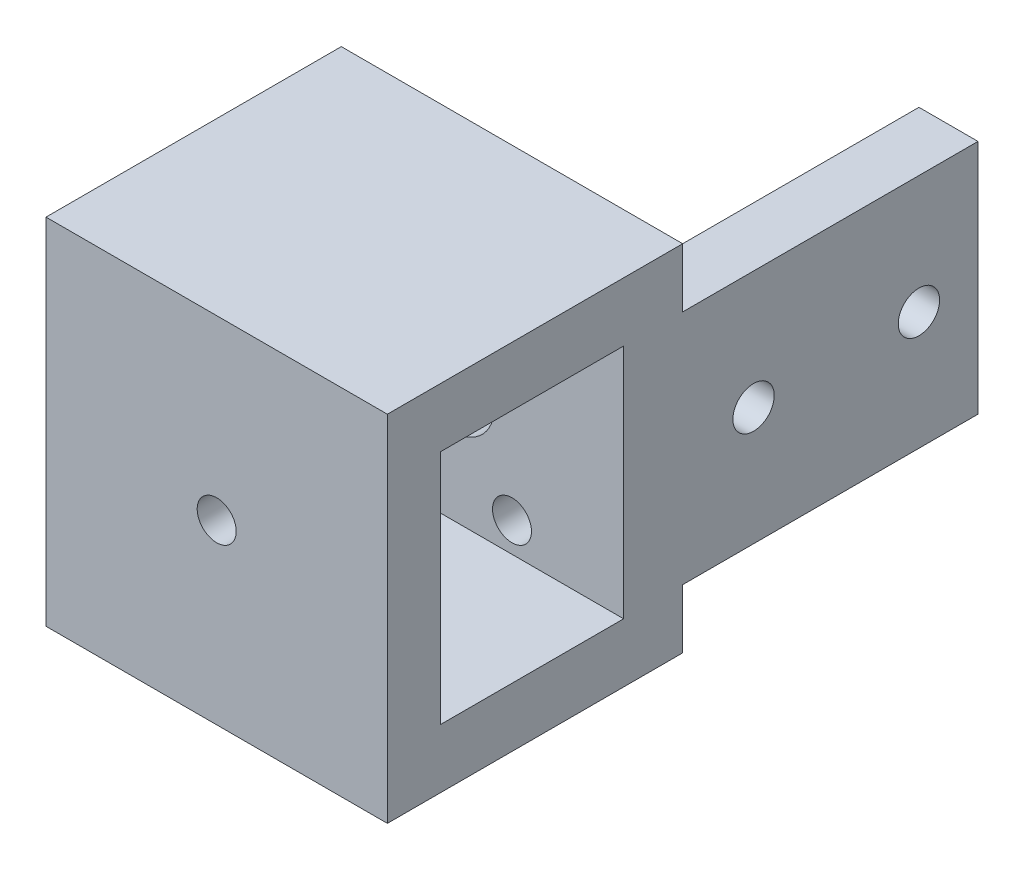
ISO-10303-21;
HEADER;
FILE_DESCRIPTION(('STEP AP214'),'2;1');
FILE_NAME('part.step','',(''),(''),'','','');
FILE_SCHEMA(('AUTOMOTIVE_DESIGN { 1 0 10303 214 1 1 1 1 }'));
ENDSEC;
DATA;
#1=APPLICATION_CONTEXT('core data for automotive mechanical design processes');
#2=APPLICATION_PROTOCOL_DEFINITION('international standard','automotive_design',2000,#1);
#3=PRODUCT_CONTEXT('',#1,'mechanical');
#4=PRODUCT('Part','Part','',(#3));
#5=PRODUCT_RELATED_PRODUCT_CATEGORY('part','',(#4));
#6=PRODUCT_DEFINITION_FORMATION('','',#4);
#7=PRODUCT_DEFINITION_CONTEXT('part definition',#1,'design');
#8=PRODUCT_DEFINITION('design','',#6,#7);
#9=PRODUCT_DEFINITION_SHAPE('','',#8);
#10=(LENGTH_UNIT() NAMED_UNIT(*) SI_UNIT(.MILLI.,.METRE.));
#11=(NAMED_UNIT(*) PLANE_ANGLE_UNIT() SI_UNIT($,.RADIAN.));
#12=(NAMED_UNIT(*) SI_UNIT($,.STERADIAN.) SOLID_ANGLE_UNIT());
#13=UNCERTAINTY_MEASURE_WITH_UNIT(LENGTH_MEASURE(1.E-05),#10,'distance_accuracy_value','');
#14=(GEOMETRIC_REPRESENTATION_CONTEXT(3) GLOBAL_UNCERTAINTY_ASSIGNED_CONTEXT((#13)) GLOBAL_UNIT_ASSIGNED_CONTEXT((#10,
#11,#12)) REPRESENTATION_CONTEXT('',''));
#15=CARTESIAN_POINT('',(0.,0.,0.));
#16=DIRECTION('',(0.,0.,1.));
#17=DIRECTION('',(1.,0.,0.));
#18=AXIS2_PLACEMENT_3D('',#15,#16,#17);
#19=CARTESIAN_POINT('',(0.,0.,25.));
#20=DIRECTION('',(0.,1.,0.));
#21=DIRECTION('',(0.,0.,1.));
#22=AXIS2_PLACEMENT_3D('',#19,#20,#21);
#23=PLANE('',#22);
#24=DIRECTION('',(0.,0.,-1.));
#25=VECTOR('',#24,1.);
#26=CARTESIAN_POINT('',(0.,0.,25.));
#27=LINE('',#26,#25);
#28=CARTESIAN_POINT('',(0.,0.,20.5));
#29=VERTEX_POINT('',#28);
#30=CARTESIAN_POINT('',(0.,0.,5.));
#31=VERTEX_POINT('',#30);
#32=EDGE_CURVE('E63',#29,#31,#27,.T.);
#33=ORIENTED_EDGE('',*,*,#32,.F.);
#34=DIRECTION('',(1.,0.,0.));
#35=VECTOR('',#34,1.);
#36=CARTESIAN_POINT('',(0.,0.,20.5));
#37=LINE('',#36,#35);
#38=CARTESIAN_POINT('',(28.9,0.,20.5));
#39=VERTEX_POINT('',#38);
#40=EDGE_CURVE('E58',#29,#39,#37,.T.);
#41=ORIENTED_EDGE('',*,*,#40,.T.);
#42=DIRECTION('',(0.,0.,-1.));
#43=VECTOR('',#42,1.);
#44=CARTESIAN_POINT('',(28.9,0.,25.));
#45=LINE('',#44,#43);
#46=CARTESIAN_POINT('',(28.9,0.,5.));
#47=VERTEX_POINT('',#46);
#48=EDGE_CURVE('E137',#39,#47,#45,.T.);
#49=ORIENTED_EDGE('',*,*,#48,.T.);
#50=DIRECTION('',(1.,0.,0.));
#51=VECTOR('',#50,1.);
#52=CARTESIAN_POINT('',(0.,0.,5.));
#53=LINE('',#52,#51);
#54=EDGE_CURVE('E50',#31,#47,#53,.T.);
#55=ORIENTED_EDGE('',*,*,#54,.F.);
#56=EDGE_LOOP('',(#33,#41,#49,#55));
#57=FACE_BOUND('',#56,.T.);
#58=ADVANCED_FACE('F41',(#57),#23,.T.);
#59=CARTESIAN_POINT('',(0.,20.,25.));
#60=DIRECTION('',(0.,1.,0.));
#61=DIRECTION('',(0.,0.,1.));
#62=AXIS2_PLACEMENT_3D('',#59,#60,#61);
#63=PLANE('',#62);
#64=DIRECTION('',(-1.,0.,0.));
#65=VECTOR('',#64,1.);
#66=CARTESIAN_POINT('',(0.,20.,20.5));
#67=LINE('',#66,#65);
#68=CARTESIAN_POINT('',(28.9,20.,20.5));
#69=VERTEX_POINT('',#68);
#70=CARTESIAN_POINT('',(0.,20.,20.5));
#71=VERTEX_POINT('',#70);
#72=EDGE_CURVE('E139',#69,#71,#67,.T.);
#73=ORIENTED_EDGE('',*,*,#72,.T.);
#74=DIRECTION('',(0.,0.,-1.));
#75=VECTOR('',#74,1.);
#76=CARTESIAN_POINT('',(0.,20.,25.));
#77=LINE('',#76,#75);
#78=CARTESIAN_POINT('',(0.,20.,5.));
#79=VERTEX_POINT('',#78);
#80=EDGE_CURVE('E253',#71,#79,#77,.T.);
#81=ORIENTED_EDGE('',*,*,#80,.T.);
#82=DIRECTION('',(1.,0.,0.));
#83=VECTOR('',#82,1.);
#84=CARTESIAN_POINT('',(0.,20.,5.));
#85=LINE('',#84,#83);
#86=CARTESIAN_POINT('',(28.9,20.,5.));
#87=VERTEX_POINT('',#86);
#88=EDGE_CURVE('E152',#79,#87,#85,.T.);
#89=ORIENTED_EDGE('',*,*,#88,.T.);
#90=DIRECTION('',(0.,0.,-1.));
#91=VECTOR('',#90,1.);
#92=CARTESIAN_POINT('',(28.9,20.,25.));
#93=LINE('',#92,#91);
#94=EDGE_CURVE('E135',#69,#87,#93,.T.);
#95=ORIENTED_EDGE('',*,*,#94,.F.);
#96=EDGE_LOOP('',(#73,#81,#89,#95));
#97=FACE_BOUND('',#96,.T.);
#98=ADVANCED_FACE('F150',(#97),#63,.F.);
#99=CARTESIAN_POINT('',(0.,0.,0.));
#100=DIRECTION('',(0.,0.,1.));
#101=DIRECTION('',(1.,0.,0.));
#102=AXIS2_PLACEMENT_3D('',#99,#100,#101);
#103=PLANE('',#102);
#104=CARTESIAN_POINT('',(14.45,10.,0.));
#105=DIRECTION('',(0.,0.,1.));
#106=DIRECTION('',(1.,0.,0.));
#107=AXIS2_PLACEMENT_3D('',#104,#105,#106);
#108=CIRCLE('',#107,3.5);
#109=CARTESIAN_POINT('',(17.95,10.,0.));
#110=VERTEX_POINT('',#109);
#111=EDGE_CURVE('E307',#110,#110,#108,.T.);
#112=ORIENTED_EDGE('',*,*,#111,.T.);
#113=EDGE_LOOP('',(#112));
#114=FACE_BOUND('',#113,.T.);
#115=CARTESIAN_POINT('',(9.45,2.5,0.));
#116=DIRECTION('',(0.,0.,1.));
#117=DIRECTION('',(1.,0.,0.));
#118=AXIS2_PLACEMENT_3D('',#115,#116,#117);
#119=CIRCLE('',#118,1.65);
#120=CARTESIAN_POINT('',(11.1,2.5,0.));
#121=VERTEX_POINT('',#120);
#122=EDGE_CURVE('E45',#121,#121,#119,.F.);
#123=ORIENTED_EDGE('',*,*,#122,.F.);
#124=EDGE_LOOP('',(#123));
#125=FACE_BOUND('',#124,.T.);
#126=CARTESIAN_POINT('',(9.45,17.5,0.));
#127=DIRECTION('',(0.,0.,1.));
#128=DIRECTION('',(1.,0.,0.));
#129=AXIS2_PLACEMENT_3D('',#126,#127,#128);
#130=CIRCLE('',#129,1.65);
#131=CARTESIAN_POINT('',(11.1,17.5,0.));
#132=VERTEX_POINT('',#131);
#133=EDGE_CURVE('E187',#132,#132,#130,.T.);
#134=ORIENTED_EDGE('',*,*,#133,.T.);
#135=EDGE_LOOP('',(#134));
#136=FACE_BOUND('',#135,.T.);
#137=CARTESIAN_POINT('',(19.45,17.5,0.));
#138=DIRECTION('',(0.,0.,1.));
#139=DIRECTION('',(1.,0.,0.));
#140=AXIS2_PLACEMENT_3D('',#137,#138,#139);
#141=CIRCLE('',#140,1.65);
#142=CARTESIAN_POINT('',(21.1,17.5,0.));
#143=VERTEX_POINT('',#142);
#144=EDGE_CURVE('E184',#143,#143,#141,.F.);
#145=ORIENTED_EDGE('',*,*,#144,.F.);
#146=EDGE_LOOP('',(#145));
#147=FACE_BOUND('',#146,.T.);
#148=CARTESIAN_POINT('',(19.45,2.5,0.));
#149=DIRECTION('',(0.,0.,1.));
#150=DIRECTION('',(1.,0.,0.));
#151=AXIS2_PLACEMENT_3D('',#148,#149,#150);
#152=CIRCLE('',#151,1.65);
#153=CARTESIAN_POINT('',(21.1,2.5,0.));
#154=VERTEX_POINT('',#153);
#155=EDGE_CURVE('E181',#154,#154,#152,.T.);
#156=ORIENTED_EDGE('',*,*,#155,.T.);
#157=EDGE_LOOP('',(#156));
#158=FACE_BOUND('',#157,.T.);
#159=DIRECTION('',(1.,0.,0.));
#160=VECTOR('',#159,1.);
#161=CARTESIAN_POINT('',(23.9,20.,0.));
#162=LINE('',#161,#160);
#163=CARTESIAN_POINT('',(23.9,20.,0.));
#164=VERTEX_POINT('',#163);
#165=CARTESIAN_POINT('',(28.9,20.,0.));
#166=VERTEX_POINT('',#165);
#167=EDGE_CURVE('E216',#164,#166,#162,.T.);
#168=ORIENTED_EDGE('',*,*,#167,.F.);
#169=DIRECTION('',(0.,-1.,0.));
#170=VECTOR('',#169,1.);
#171=CARTESIAN_POINT('',(23.9,0.,0.));
#172=LINE('',#171,#170);
#173=CARTESIAN_POINT('',(23.9,0.,0.));
#174=VERTEX_POINT('',#173);
#175=EDGE_CURVE('E218',#164,#174,#172,.T.);
#176=ORIENTED_EDGE('',*,*,#175,.T.);
#177=DIRECTION('',(1.,0.,0.));
#178=VECTOR('',#177,1.);
#179=CARTESIAN_POINT('',(23.9,0.,0.));
#180=LINE('',#179,#178);
#181=CARTESIAN_POINT('',(28.9,0.,0.));
#182=VERTEX_POINT('',#181);
#183=EDGE_CURVE('E236',#174,#182,#180,.T.);
#184=ORIENTED_EDGE('',*,*,#183,.T.);
#185=DIRECTION('',(0.,-1.,0.));
#186=VECTOR('',#185,1.);
#187=CARTESIAN_POINT('',(28.9,0.,0.));
#188=LINE('',#187,#186);
#189=CARTESIAN_POINT('',(28.9,-5.,0.));
#190=VERTEX_POINT('',#189);
#191=EDGE_CURVE('E190',#182,#190,#188,.T.);
#192=ORIENTED_EDGE('',*,*,#191,.T.);
#193=DIRECTION('',(1.,0.,0.));
#194=VECTOR('',#193,1.);
#195=CARTESIAN_POINT('',(0.,-5.,0.));
#196=LINE('',#195,#194);
#197=CARTESIAN_POINT('',(0.,-5.,0.));
#198=VERTEX_POINT('',#197);
#199=EDGE_CURVE('E153',#198,#190,#196,.T.);
#200=ORIENTED_EDGE('',*,*,#199,.F.);
#201=DIRECTION('',(0.,-1.,0.));
#202=VECTOR('',#201,1.);
#203=CARTESIAN_POINT('',(0.,0.,0.));
#204=LINE('',#203,#202);
#205=CARTESIAN_POINT('',(0.,25.,0.));
#206=VERTEX_POINT('',#205);
#207=EDGE_CURVE('E193',#206,#198,#204,.T.);
#208=ORIENTED_EDGE('',*,*,#207,.F.);
#209=DIRECTION('',(1.,0.,0.));
#210=VECTOR('',#209,1.);
#211=CARTESIAN_POINT('',(0.,25.,0.));
#212=LINE('',#211,#210);
#213=CARTESIAN_POINT('',(28.9,25.,0.));
#214=VERTEX_POINT('',#213);
#215=EDGE_CURVE('E224',#206,#214,#212,.T.);
#216=ORIENTED_EDGE('',*,*,#215,.T.);
#217=EDGE_CURVE('E191',#214,#166,#188,.T.);
#218=ORIENTED_EDGE('',*,*,#217,.T.);
#219=EDGE_LOOP('',(#168,#176,#184,#192,#200,#208,#216,#218));
#220=FACE_BOUND('',#219,.T.);
#221=ADVANCED_FACE('F203',(#114,#125,#136,#147,#158,#220),#103,.F.);
#222=CARTESIAN_POINT('',(28.9,0.,5.));
#223=DIRECTION('',(1.,0.,0.));
#224=DIRECTION('',(0.,1.,0.));
#225=AXIS2_PLACEMENT_3D('',#222,#223,#224);
#226=PLANE('',#225);
#227=ORIENTED_EDGE('',*,*,#48,.F.);
#228=DIRECTION('',(0.,1.,0.));
#229=VECTOR('',#228,1.);
#230=CARTESIAN_POINT('',(28.9,20.,20.5));
#231=LINE('',#230,#229);
#232=EDGE_CURVE('E129',#39,#69,#231,.T.);
#233=ORIENTED_EDGE('',*,*,#232,.T.);
#234=ORIENTED_EDGE('',*,*,#94,.T.);
#235=DIRECTION('',(0.,-1.,0.));
#236=VECTOR('',#235,1.);
#237=CARTESIAN_POINT('',(28.9,0.,5.));
#238=LINE('',#237,#236);
#239=EDGE_CURVE('E173',#87,#47,#238,.T.);
#240=ORIENTED_EDGE('',*,*,#239,.T.);
#241=EDGE_LOOP('',(#227,#233,#234,#240));
#242=FACE_BOUND('',#241,.T.);
#243=ORIENTED_EDGE('',*,*,#217,.F.);
#244=DIRECTION('',(0.,0.,-1.));
#245=VECTOR('',#244,1.);
#246=CARTESIAN_POINT('',(28.9,25.,25.));
#247=LINE('',#246,#245);
#248=CARTESIAN_POINT('',(28.9,25.,25.));
#249=VERTEX_POINT('',#248);
#250=EDGE_CURVE('E154',#249,#214,#247,.T.);
#251=ORIENTED_EDGE('',*,*,#250,.F.);
#252=DIRECTION('',(0.,-1.,0.));
#253=VECTOR('',#252,1.);
#254=CARTESIAN_POINT('',(28.9,0.,25.));
#255=LINE('',#254,#253);
#256=CARTESIAN_POINT('',(28.9,-5.,25.));
#257=VERTEX_POINT('',#256);
#258=EDGE_CURVE('E157',#249,#257,#255,.T.);
#259=ORIENTED_EDGE('',*,*,#258,.T.);
#260=DIRECTION('',(0.,0.,-1.));
#261=VECTOR('',#260,1.);
#262=CARTESIAN_POINT('',(28.9,-5.,25.));
#263=LINE('',#262,#261);
#264=EDGE_CURVE('E244',#257,#190,#263,.T.);
#265=ORIENTED_EDGE('',*,*,#264,.T.);
#266=ORIENTED_EDGE('',*,*,#191,.F.);
#267=DIRECTION('',(0.,0.,-1.));
#268=VECTOR('',#267,1.);
#269=CARTESIAN_POINT('',(28.9,0.,0.));
#270=LINE('',#269,#268);
#271=CARTESIAN_POINT('',(28.9,0.,-25.));
#272=VERTEX_POINT('',#271);
#273=EDGE_CURVE('E278',#182,#272,#270,.T.);
#274=ORIENTED_EDGE('',*,*,#273,.T.);
#275=DIRECTION('',(0.,1.,0.));
#276=VECTOR('',#275,1.);
#277=CARTESIAN_POINT('',(28.9,0.,-25.));
#278=LINE('',#277,#276);
#279=CARTESIAN_POINT('',(28.9,20.,-25.));
#280=VERTEX_POINT('',#279);
#281=EDGE_CURVE('E275',#272,#280,#278,.T.);
#282=ORIENTED_EDGE('',*,*,#281,.T.);
#283=DIRECTION('',(0.,0.,1.));
#284=VECTOR('',#283,1.);
#285=CARTESIAN_POINT('',(28.9,20.,0.));
#286=LINE('',#285,#284);
#287=EDGE_CURVE('E232',#280,#166,#286,.T.);
#288=ORIENTED_EDGE('',*,*,#287,.T.);
#289=EDGE_LOOP('',(#243,#251,#259,#265,#266,#274,#282,#288));
#290=FACE_BOUND('',#289,.T.);
#291=CARTESIAN_POINT('',(28.9,10.,-6.));
#292=DIRECTION('',(1.,0.,0.));
#293=DIRECTION('',(0.,1.,0.));
#294=AXIS2_PLACEMENT_3D('',#291,#292,#293);
#295=CIRCLE('',#294,1.75);
#296=CARTESIAN_POINT('',(28.9,11.75,-6.));
#297=VERTEX_POINT('',#296);
#298=EDGE_CURVE('E147',#297,#297,#295,.T.);
#299=ORIENTED_EDGE('',*,*,#298,.F.);
#300=EDGE_LOOP('',(#299));
#301=FACE_BOUND('',#300,.T.);
#302=CARTESIAN_POINT('',(28.9,10.,-20.));
#303=DIRECTION('',(1.,0.,0.));
#304=DIRECTION('',(0.,1.,0.));
#305=AXIS2_PLACEMENT_3D('',#302,#303,#304);
#306=CIRCLE('',#305,1.75);
#307=CARTESIAN_POINT('',(28.9,11.75,-20.));
#308=VERTEX_POINT('',#307);
#309=EDGE_CURVE('E288',#308,#308,#306,.T.);
#310=ORIENTED_EDGE('',*,*,#309,.F.);
#311=EDGE_LOOP('',(#310));
#312=FACE_BOUND('',#311,.T.);
#313=ADVANCED_FACE('F131',(#242,#290,#301,#312),#226,.T.);
#314=CARTESIAN_POINT('',(0.,0.,5.));
#315=DIRECTION('',(1.,0.,0.));
#316=DIRECTION('',(0.,1.,0.));
#317=AXIS2_PLACEMENT_3D('',#314,#315,#316);
#318=PLANE('',#317);
#319=DIRECTION('',(0.,-1.,0.));
#320=VECTOR('',#319,1.);
#321=CARTESIAN_POINT('',(0.,20.,20.5));
#322=LINE('',#321,#320);
#323=EDGE_CURVE('E144',#71,#29,#322,.T.);
#324=ORIENTED_EDGE('',*,*,#323,.T.);
#325=ORIENTED_EDGE('',*,*,#32,.T.);
#326=DIRECTION('',(0.,-1.,0.));
#327=VECTOR('',#326,1.);
#328=CARTESIAN_POINT('',(0.,0.,5.));
#329=LINE('',#328,#327);
#330=EDGE_CURVE('E176',#79,#31,#329,.T.);
#331=ORIENTED_EDGE('',*,*,#330,.F.);
#332=ORIENTED_EDGE('',*,*,#80,.F.);
#333=EDGE_LOOP('',(#324,#325,#331,#332));
#334=FACE_BOUND('',#333,.T.);
#335=ORIENTED_EDGE('',*,*,#207,.T.);
#336=DIRECTION('',(0.,0.,-1.));
#337=VECTOR('',#336,1.);
#338=CARTESIAN_POINT('',(0.,-5.,25.));
#339=LINE('',#338,#337);
#340=CARTESIAN_POINT('',(0.,-5.,25.));
#341=VERTEX_POINT('',#340);
#342=EDGE_CURVE('E248',#341,#198,#339,.T.);
#343=ORIENTED_EDGE('',*,*,#342,.F.);
#344=DIRECTION('',(0.,-1.,0.));
#345=VECTOR('',#344,1.);
#346=CARTESIAN_POINT('',(0.,0.,25.));
#347=LINE('',#346,#345);
#348=CARTESIAN_POINT('',(0.,25.,25.));
#349=VERTEX_POINT('',#348);
#350=EDGE_CURVE('E241',#349,#341,#347,.T.);
#351=ORIENTED_EDGE('',*,*,#350,.F.);
#352=DIRECTION('',(0.,0.,-1.));
#353=VECTOR('',#352,1.);
#354=CARTESIAN_POINT('',(0.,25.,25.));
#355=LINE('',#354,#353);
#356=EDGE_CURVE('E160',#349,#206,#355,.T.);
#357=ORIENTED_EDGE('',*,*,#356,.T.);
#358=EDGE_LOOP('',(#335,#343,#351,#357));
#359=FACE_BOUND('',#358,.T.);
#360=ADVANCED_FACE('F257',(#334,#359),#318,.F.);
#361=CARTESIAN_POINT('',(9.45,17.5,5.));
#362=DIRECTION('',(0.,0.,-1.));
#363=DIRECTION('',(-1.,0.,0.));
#364=AXIS2_PLACEMENT_3D('',#361,#362,#363);
#365=CYLINDRICAL_SURFACE('',#364,1.65);
#366=CARTESIAN_POINT('',(9.45,17.5,5.));
#367=DIRECTION('',(0.,0.,1.));
#368=DIRECTION('',(1.,0.,0.));
#369=AXIS2_PLACEMENT_3D('',#366,#367,#368);
#370=CIRCLE('',#369,1.65);
#371=CARTESIAN_POINT('',(11.1,17.5,5.));
#372=VERTEX_POINT('',#371);
#373=EDGE_CURVE('E170',#372,#372,#370,.T.);
#374=ORIENTED_EDGE('',*,*,#373,.T.);
#375=EDGE_LOOP('',(#374));
#376=FACE_BOUND('',#375,.T.);
#377=ORIENTED_EDGE('',*,*,#133,.F.);
#378=EDGE_LOOP('',(#377));
#379=FACE_BOUND('',#378,.T.);
#380=ADVANCED_FACE('F426',(#376,#379),#365,.F.);
#381=CARTESIAN_POINT('',(19.45,17.5,5.));
#382=DIRECTION('',(0.,0.,-1.));
#383=DIRECTION('',(-1.,0.,0.));
#384=AXIS2_PLACEMENT_3D('',#381,#382,#383);
#385=CYLINDRICAL_SURFACE('',#384,1.65);
#386=CARTESIAN_POINT('',(19.45,17.5,5.));
#387=DIRECTION('',(0.,0.,1.));
#388=DIRECTION('',(1.,0.,0.));
#389=AXIS2_PLACEMENT_3D('',#386,#387,#388);
#390=CIRCLE('',#389,1.65);
#391=CARTESIAN_POINT('',(21.1,17.5,5.));
#392=VERTEX_POINT('',#391);
#393=EDGE_CURVE('E167',#392,#392,#390,.F.);
#394=ORIENTED_EDGE('',*,*,#393,.F.);
#395=EDGE_LOOP('',(#394));
#396=FACE_BOUND('',#395,.T.);
#397=ORIENTED_EDGE('',*,*,#144,.T.);
#398=EDGE_LOOP('',(#397));
#399=FACE_BOUND('',#398,.T.);
#400=ADVANCED_FACE('F335',(#396,#399),#385,.F.);
#401=CARTESIAN_POINT('',(19.45,2.5,5.));
#402=DIRECTION('',(0.,0.,-1.));
#403=DIRECTION('',(-1.,0.,0.));
#404=AXIS2_PLACEMENT_3D('',#401,#402,#403);
#405=CYLINDRICAL_SURFACE('',#404,1.65);
#406=CARTESIAN_POINT('',(19.45,2.5,5.));
#407=DIRECTION('',(0.,0.,1.));
#408=DIRECTION('',(1.,0.,0.));
#409=AXIS2_PLACEMENT_3D('',#406,#407,#408);
#410=CIRCLE('',#409,1.65);
#411=CARTESIAN_POINT('',(21.1,2.5,5.));
#412=VERTEX_POINT('',#411);
#413=EDGE_CURVE('E164',#412,#412,#410,.T.);
#414=ORIENTED_EDGE('',*,*,#413,.T.);
#415=EDGE_LOOP('',(#414));
#416=FACE_BOUND('',#415,.T.);
#417=ORIENTED_EDGE('',*,*,#155,.F.);
#418=EDGE_LOOP('',(#417));
#419=FACE_BOUND('',#418,.T.);
#420=ADVANCED_FACE('F43',(#416,#419),#405,.F.);
#421=CARTESIAN_POINT('',(9.45,2.5,5.));
#422=DIRECTION('',(0.,0.,-1.));
#423=DIRECTION('',(-1.,0.,0.));
#424=AXIS2_PLACEMENT_3D('',#421,#422,#423);
#425=CYLINDRICAL_SURFACE('',#424,1.65);
#426=CARTESIAN_POINT('',(9.45,2.5,5.));
#427=DIRECTION('',(0.,0.,1.));
#428=DIRECTION('',(1.,0.,0.));
#429=AXIS2_PLACEMENT_3D('',#426,#427,#428);
#430=CIRCLE('',#429,1.65);
#431=CARTESIAN_POINT('',(11.1,2.5,5.));
#432=VERTEX_POINT('',#431);
#433=EDGE_CURVE('E11',#432,#432,#430,.F.);
#434=ORIENTED_EDGE('',*,*,#433,.F.);
#435=EDGE_LOOP('',(#434));
#436=FACE_BOUND('',#435,.T.);
#437=ORIENTED_EDGE('',*,*,#122,.T.);
#438=EDGE_LOOP('',(#437));
#439=FACE_BOUND('',#438,.T.);
#440=ADVANCED_FACE('F201',(#436,#439),#425,.F.);
#441=CARTESIAN_POINT('',(0.,0.,5.));
#442=DIRECTION('',(0.,0.,1.));
#443=DIRECTION('',(1.,0.,0.));
#444=AXIS2_PLACEMENT_3D('',#441,#442,#443);
#445=PLANE('',#444);
#446=CARTESIAN_POINT('',(14.45,10.,5.));
#447=DIRECTION('',(0.,0.,1.));
#448=DIRECTION('',(1.,0.,0.));
#449=AXIS2_PLACEMENT_3D('',#446,#447,#448);
#450=CIRCLE('',#449,3.5);
#451=CARTESIAN_POINT('',(17.95,10.,5.));
#452=VERTEX_POINT('',#451);
#453=EDGE_CURVE('E304',#452,#452,#450,.T.);
#454=ORIENTED_EDGE('',*,*,#453,.F.);
#455=EDGE_LOOP('',(#454));
#456=FACE_BOUND('',#455,.T.);
#457=ORIENTED_EDGE('',*,*,#413,.F.);
#458=EDGE_LOOP('',(#457));
#459=FACE_BOUND('',#458,.T.);
#460=ORIENTED_EDGE('',*,*,#393,.T.);
#461=EDGE_LOOP('',(#460));
#462=FACE_BOUND('',#461,.T.);
#463=ORIENTED_EDGE('',*,*,#373,.F.);
#464=EDGE_LOOP('',(#463));
#465=FACE_BOUND('',#464,.T.);
#466=ORIENTED_EDGE('',*,*,#239,.F.);
#467=ORIENTED_EDGE('',*,*,#88,.F.);
#468=ORIENTED_EDGE('',*,*,#330,.T.);
#469=ORIENTED_EDGE('',*,*,#54,.T.);
#470=EDGE_LOOP('',(#466,#467,#468,#469));
#471=FACE_BOUND('',#470,.T.);
#472=ORIENTED_EDGE('',*,*,#433,.T.);
#473=EDGE_LOOP('',(#472));
#474=FACE_BOUND('',#473,.T.);
#475=ADVANCED_FACE('F316',(#456,#459,#462,#465,#471,#474),#445,.T.);
#476=CARTESIAN_POINT('',(0.,-5.,25.));
#477=DIRECTION('',(0.,1.,0.));
#478=DIRECTION('',(0.,0.,1.));
#479=AXIS2_PLACEMENT_3D('',#476,#477,#478);
#480=PLANE('',#479);
#481=ORIENTED_EDGE('',*,*,#199,.T.);
#482=ORIENTED_EDGE('',*,*,#264,.F.);
#483=DIRECTION('',(1.,0.,0.));
#484=VECTOR('',#483,1.);
#485=CARTESIAN_POINT('',(0.,-5.,25.));
#486=LINE('',#485,#484);
#487=EDGE_CURVE('E243',#341,#257,#486,.T.);
#488=ORIENTED_EDGE('',*,*,#487,.F.);
#489=ORIENTED_EDGE('',*,*,#342,.T.);
#490=EDGE_LOOP('',(#481,#482,#488,#489));
#491=FACE_BOUND('',#490,.T.);
#492=ADVANCED_FACE('F266',(#491),#480,.F.);
#493=CARTESIAN_POINT('',(0.,0.,25.));
#494=DIRECTION('',(0.,0.,1.));
#495=DIRECTION('',(1.,0.,0.));
#496=AXIS2_PLACEMENT_3D('',#493,#494,#495);
#497=PLANE('',#496);
#498=ORIENTED_EDGE('',*,*,#258,.F.);
#499=DIRECTION('',(1.,0.,0.));
#500=VECTOR('',#499,1.);
#501=CARTESIAN_POINT('',(0.,25.,25.));
#502=LINE('',#501,#500);
#503=EDGE_CURVE('E227',#349,#249,#502,.T.);
#504=ORIENTED_EDGE('',*,*,#503,.F.);
#505=ORIENTED_EDGE('',*,*,#350,.T.);
#506=ORIENTED_EDGE('',*,*,#487,.T.);
#507=EDGE_LOOP('',(#498,#504,#505,#506));
#508=FACE_BOUND('',#507,.T.);
#509=CARTESIAN_POINT('',(14.45,10.,25.));
#510=DIRECTION('',(0.,0.,1.));
#511=DIRECTION('',(1.,0.,0.));
#512=AXIS2_PLACEMENT_3D('',#509,#510,#511);
#513=CIRCLE('',#512,1.65);
#514=CARTESIAN_POINT('',(16.1,10.,25.));
#515=VERTEX_POINT('',#514);
#516=EDGE_CURVE('E301',#515,#515,#513,.T.);
#517=ORIENTED_EDGE('',*,*,#516,.F.);
#518=EDGE_LOOP('',(#517));
#519=FACE_BOUND('',#518,.T.);
#520=ADVANCED_FACE('F269',(#508,#519),#497,.T.);
#521=CARTESIAN_POINT('',(0.,25.,25.));
#522=DIRECTION('',(0.,1.,0.));
#523=DIRECTION('',(0.,0.,1.));
#524=AXIS2_PLACEMENT_3D('',#521,#522,#523);
#525=PLANE('',#524);
#526=ORIENTED_EDGE('',*,*,#215,.F.);
#527=ORIENTED_EDGE('',*,*,#356,.F.);
#528=ORIENTED_EDGE('',*,*,#503,.T.);
#529=ORIENTED_EDGE('',*,*,#250,.T.);
#530=EDGE_LOOP('',(#526,#527,#528,#529));
#531=FACE_BOUND('',#530,.T.);
#532=ADVANCED_FACE('F260',(#531),#525,.T.);
#533=CARTESIAN_POINT('',(23.9,20.,0.));
#534=DIRECTION('',(0.,1.,0.));
#535=DIRECTION('',(-1.,0.,0.));
#536=AXIS2_PLACEMENT_3D('',#533,#534,#535);
#537=PLANE('',#536);
#538=ORIENTED_EDGE('',*,*,#287,.F.);
#539=DIRECTION('',(1.,0.,0.));
#540=VECTOR('',#539,1.);
#541=CARTESIAN_POINT('',(23.9,20.,-25.));
#542=LINE('',#541,#540);
#543=CARTESIAN_POINT('',(23.9,20.,-25.));
#544=VERTEX_POINT('',#543);
#545=EDGE_CURVE('E225',#544,#280,#542,.T.);
#546=ORIENTED_EDGE('',*,*,#545,.F.);
#547=DIRECTION('',(0.,0.,1.));
#548=VECTOR('',#547,1.);
#549=CARTESIAN_POINT('',(23.9,20.,0.));
#550=LINE('',#549,#548);
#551=EDGE_CURVE('E238',#544,#164,#550,.T.);
#552=ORIENTED_EDGE('',*,*,#551,.T.);
#553=ORIENTED_EDGE('',*,*,#167,.T.);
#554=EDGE_LOOP('',(#538,#546,#552,#553));
#555=FACE_BOUND('',#554,.T.);
#556=ADVANCED_FACE('F349',(#555),#537,.T.);
#557=CARTESIAN_POINT('',(23.9,0.,-25.));
#558=DIRECTION('',(0.,0.,-1.));
#559=DIRECTION('',(-1.,0.,0.));
#560=AXIS2_PLACEMENT_3D('',#557,#558,#559);
#561=PLANE('',#560);
#562=ORIENTED_EDGE('',*,*,#281,.F.);
#563=DIRECTION('',(1.,0.,0.));
#564=VECTOR('',#563,1.);
#565=CARTESIAN_POINT('',(23.9,0.,-25.));
#566=LINE('',#565,#564);
#567=CARTESIAN_POINT('',(23.9,0.,-25.));
#568=VERTEX_POINT('',#567);
#569=EDGE_CURVE('E229',#568,#272,#566,.T.);
#570=ORIENTED_EDGE('',*,*,#569,.F.);
#571=DIRECTION('',(0.,1.,0.));
#572=VECTOR('',#571,1.);
#573=CARTESIAN_POINT('',(23.9,0.,-25.));
#574=LINE('',#573,#572);
#575=EDGE_CURVE('E283',#568,#544,#574,.T.);
#576=ORIENTED_EDGE('',*,*,#575,.T.);
#577=ORIENTED_EDGE('',*,*,#545,.T.);
#578=EDGE_LOOP('',(#562,#570,#576,#577));
#579=FACE_BOUND('',#578,.T.);
#580=ADVANCED_FACE('F353',(#579),#561,.T.);
#581=CARTESIAN_POINT('',(23.9,0.,0.));
#582=DIRECTION('',(0.,-1.,0.));
#583=DIRECTION('',(0.,0.,-1.));
#584=AXIS2_PLACEMENT_3D('',#581,#582,#583);
#585=PLANE('',#584);
#586=ORIENTED_EDGE('',*,*,#273,.F.);
#587=ORIENTED_EDGE('',*,*,#183,.F.);
#588=DIRECTION('',(0.,0.,-1.));
#589=VECTOR('',#588,1.);
#590=CARTESIAN_POINT('',(23.9,0.,0.));
#591=LINE('',#590,#589);
#592=EDGE_CURVE('E276',#174,#568,#591,.T.);
#593=ORIENTED_EDGE('',*,*,#592,.T.);
#594=ORIENTED_EDGE('',*,*,#569,.T.);
#595=EDGE_LOOP('',(#586,#587,#593,#594));
#596=FACE_BOUND('',#595,.T.);
#597=ADVANCED_FACE('F361',(#596),#585,.T.);
#598=CARTESIAN_POINT('',(23.9,0.,0.));
#599=DIRECTION('',(-1.,0.,0.));
#600=DIRECTION('',(0.,-1.,0.));
#601=AXIS2_PLACEMENT_3D('',#598,#599,#600);
#602=PLANE('',#601);
#603=CARTESIAN_POINT('',(23.9,10.,-6.));
#604=DIRECTION('',(1.,0.,0.));
#605=DIRECTION('',(0.,1.,0.));
#606=AXIS2_PLACEMENT_3D('',#603,#604,#605);
#607=CIRCLE('',#606,1.75);
#608=CARTESIAN_POINT('',(23.9,11.75,-6.));
#609=VERTEX_POINT('',#608);
#610=EDGE_CURVE('E291',#609,#609,#607,.T.);
#611=ORIENTED_EDGE('',*,*,#610,.T.);
#612=EDGE_LOOP('',(#611));
#613=FACE_BOUND('',#612,.T.);
#614=CARTESIAN_POINT('',(23.9,10.,-20.));
#615=DIRECTION('',(1.,0.,0.));
#616=DIRECTION('',(0.,1.,0.));
#617=AXIS2_PLACEMENT_3D('',#614,#615,#616);
#618=CIRCLE('',#617,1.75);
#619=CARTESIAN_POINT('',(23.9,11.75,-20.));
#620=VERTEX_POINT('',#619);
#621=EDGE_CURVE('E279',#620,#620,#618,.T.);
#622=ORIENTED_EDGE('',*,*,#621,.T.);
#623=EDGE_LOOP('',(#622));
#624=FACE_BOUND('',#623,.T.);
#625=ORIENTED_EDGE('',*,*,#175,.F.);
#626=ORIENTED_EDGE('',*,*,#551,.F.);
#627=ORIENTED_EDGE('',*,*,#575,.F.);
#628=ORIENTED_EDGE('',*,*,#592,.F.);
#629=EDGE_LOOP('',(#625,#626,#627,#628));
#630=FACE_BOUND('',#629,.T.);
#631=ADVANCED_FACE('F364',(#613,#624,#630),#602,.T.);
#632=CARTESIAN_POINT('',(23.9,10.,-20.));
#633=DIRECTION('',(1.,0.,0.));
#634=DIRECTION('',(0.,1.,0.));
#635=AXIS2_PLACEMENT_3D('',#632,#633,#634);
#636=CYLINDRICAL_SURFACE('',#635,1.75);
#637=ORIENTED_EDGE('',*,*,#621,.F.);
#638=EDGE_LOOP('',(#637));
#639=FACE_BOUND('',#638,.T.);
#640=ORIENTED_EDGE('',*,*,#309,.T.);
#641=EDGE_LOOP('',(#640));
#642=FACE_BOUND('',#641,.T.);
#643=ADVANCED_FACE('F371',(#639,#642),#636,.F.);
#644=CARTESIAN_POINT('',(23.9,10.,-6.));
#645=DIRECTION('',(1.,0.,0.));
#646=DIRECTION('',(0.,1.,0.));
#647=AXIS2_PLACEMENT_3D('',#644,#645,#646);
#648=CYLINDRICAL_SURFACE('',#647,1.75);
#649=ORIENTED_EDGE('',*,*,#610,.F.);
#650=EDGE_LOOP('',(#649));
#651=FACE_BOUND('',#650,.T.);
#652=ORIENTED_EDGE('',*,*,#298,.T.);
#653=EDGE_LOOP('',(#652));
#654=FACE_BOUND('',#653,.T.);
#655=ADVANCED_FACE('F375',(#651,#654),#648,.F.);
#656=CARTESIAN_POINT('',(0.,0.,20.5));
#657=DIRECTION('',(0.,0.,1.));
#658=DIRECTION('',(1.,0.,0.));
#659=AXIS2_PLACEMENT_3D('',#656,#657,#658);
#660=PLANE('',#659);
#661=CARTESIAN_POINT('',(14.45,10.,20.5));
#662=DIRECTION('',(0.,0.,1.));
#663=DIRECTION('',(1.,0.,0.));
#664=AXIS2_PLACEMENT_3D('',#661,#662,#663);
#665=CIRCLE('',#664,1.65);
#666=CARTESIAN_POINT('',(16.1,10.,20.5));
#667=VERTEX_POINT('',#666);
#668=EDGE_CURVE('E300',#667,#667,#665,.T.);
#669=ORIENTED_EDGE('',*,*,#668,.T.);
#670=EDGE_LOOP('',(#669));
#671=FACE_BOUND('',#670,.T.);
#672=ORIENTED_EDGE('',*,*,#323,.F.);
#673=ORIENTED_EDGE('',*,*,#72,.F.);
#674=ORIENTED_EDGE('',*,*,#232,.F.);
#675=ORIENTED_EDGE('',*,*,#40,.F.);
#676=EDGE_LOOP('',(#672,#673,#674,#675));
#677=FACE_BOUND('',#676,.T.);
#678=ADVANCED_FACE('F142',(#671,#677),#660,.F.);
#679=CARTESIAN_POINT('',(14.45,10.,20.5));
#680=DIRECTION('',(0.,0.,1.));
#681=DIRECTION('',(1.,0.,0.));
#682=AXIS2_PLACEMENT_3D('',#679,#680,#681);
#683=CYLINDRICAL_SURFACE('',#682,1.65);
#684=ORIENTED_EDGE('',*,*,#668,.F.);
#685=EDGE_LOOP('',(#684));
#686=FACE_BOUND('',#685,.T.);
#687=ORIENTED_EDGE('',*,*,#516,.T.);
#688=EDGE_LOOP('',(#687));
#689=FACE_BOUND('',#688,.T.);
#690=ADVANCED_FACE('F380',(#686,#689),#683,.F.);
#691=CARTESIAN_POINT('',(14.45,10.,-25.001));
#692=DIRECTION('',(0.,0.,1.));
#693=DIRECTION('',(1.,0.,0.));
#694=AXIS2_PLACEMENT_3D('',#691,#692,#693);
#695=CYLINDRICAL_SURFACE('',#694,3.5);
#696=CARTESIAN_POINT('',(17.95,10.,5.));
#697=CARTESIAN_POINT('',(17.95,10.,4.94791666666666));
#698=CARTESIAN_POINT('',(17.95,10.,4.89583333333333));
#699=CARTESIAN_POINT('',(17.95,10.,4.79166666666666));
#700=CARTESIAN_POINT('',(17.95,10.,4.73958333333333));
#701=CARTESIAN_POINT('',(17.95,10.,4.63541666666666));
#702=CARTESIAN_POINT('',(17.95,10.,4.58333333333333));
#703=CARTESIAN_POINT('',(17.95,10.,4.47916666666666));
#704=CARTESIAN_POINT('',(17.95,10.,4.42708333333333));
#705=CARTESIAN_POINT('',(17.95,10.,4.32291666666666));
#706=CARTESIAN_POINT('',(17.95,10.,4.27083333333333));
#707=CARTESIAN_POINT('',(17.95,10.,4.16666666666666));
#708=CARTESIAN_POINT('',(17.95,10.,4.11458333333333));
#709=CARTESIAN_POINT('',(17.95,10.,4.01041666666666));
#710=CARTESIAN_POINT('',(17.95,10.,3.95833333333333));
#711=CARTESIAN_POINT('',(17.95,10.,3.85416666666666));
#712=CARTESIAN_POINT('',(17.95,10.,3.80208333333333));
#713=CARTESIAN_POINT('',(17.95,10.,3.69791666666666));
#714=CARTESIAN_POINT('',(17.95,10.,3.64583333333333));
#715=CARTESIAN_POINT('',(17.95,10.,3.54166666666667));
#716=CARTESIAN_POINT('',(17.95,10.,3.48958333333333));
#717=CARTESIAN_POINT('',(17.95,10.,3.38541666666667));
#718=CARTESIAN_POINT('',(17.95,10.,3.33333333333333));
#719=CARTESIAN_POINT('',(17.95,10.,3.22916666666667));
#720=CARTESIAN_POINT('',(17.95,10.,3.17708333333333));
#721=CARTESIAN_POINT('',(17.95,10.,3.07291666666667));
#722=CARTESIAN_POINT('',(17.95,10.,3.02083333333333));
#723=CARTESIAN_POINT('',(17.95,10.,2.91666666666667));
#724=CARTESIAN_POINT('',(17.95,10.,2.86458333333333));
#725=CARTESIAN_POINT('',(17.95,10.,2.76041666666667));
#726=CARTESIAN_POINT('',(17.95,10.,2.70833333333333));
#727=CARTESIAN_POINT('',(17.95,10.,2.60416666666667));
#728=CARTESIAN_POINT('',(17.95,10.,2.55208333333333));
#729=CARTESIAN_POINT('',(17.95,10.,2.44791666666667));
#730=CARTESIAN_POINT('',(17.95,10.,2.39583333333333));
#731=CARTESIAN_POINT('',(17.95,10.,2.29166666666667));
#732=CARTESIAN_POINT('',(17.95,10.,2.23958333333333));
#733=CARTESIAN_POINT('',(17.95,10.,2.13541666666667));
#734=CARTESIAN_POINT('',(17.95,10.,2.08333333333333));
#735=CARTESIAN_POINT('',(17.95,10.,1.97916666666667));
#736=CARTESIAN_POINT('',(17.95,10.,1.92708333333333));
#737=CARTESIAN_POINT('',(17.95,10.,1.82291666666666));
#738=CARTESIAN_POINT('',(17.95,10.,1.77083333333333));
#739=CARTESIAN_POINT('',(17.95,10.,1.66666666666666));
#740=CARTESIAN_POINT('',(17.95,10.,1.61458333333333));
#741=CARTESIAN_POINT('',(17.95,10.,1.51041666666666));
#742=CARTESIAN_POINT('',(17.95,10.,1.45833333333333));
#743=CARTESIAN_POINT('',(17.95,10.,1.35416666666667));
#744=CARTESIAN_POINT('',(17.95,10.,1.30208333333333));
#745=CARTESIAN_POINT('',(17.95,10.,1.19791666666667));
#746=CARTESIAN_POINT('',(17.95,10.,1.14583333333333));
#747=CARTESIAN_POINT('',(17.95,10.,1.04166666666667));
#748=CARTESIAN_POINT('',(17.95,10.,0.989583333333333));
#749=CARTESIAN_POINT('',(17.95,10.,0.885416666666668));
#750=CARTESIAN_POINT('',(17.95,10.,0.833333333333334));
#751=CARTESIAN_POINT('',(17.95,10.,0.729166666666667));
#752=CARTESIAN_POINT('',(17.95,10.,0.677083333333334));
#753=CARTESIAN_POINT('',(17.95,10.,0.572916666666667));
#754=CARTESIAN_POINT('',(17.95,10.,0.520833333333334));
#755=CARTESIAN_POINT('',(17.95,10.,0.416666666666667));
#756=CARTESIAN_POINT('',(17.95,10.,0.364583333333334));
#757=CARTESIAN_POINT('',(17.95,10.,0.260416666666667));
#758=CARTESIAN_POINT('',(17.95,10.,0.208333333333333));
#759=CARTESIAN_POINT('',(17.95,10.,0.104166666666667));
#760=CARTESIAN_POINT('',(17.95,10.,0.0520833333333334));
#761=CARTESIAN_POINT('',(17.95,10.,0.));
#762=B_SPLINE_CURVE_WITH_KNOTS('',3,(#696,#697,#698,#699,#700,#701,#702,#703,#704,#705,#706,
#707,#708,#709,#710,#711,#712,#713,#714,#715,#716,#717,#718,#719,#720,#721,#722,#723,#724,#725,
#726,#727,#728,#729,#730,#731,#732,#733,#734,#735,#736,#737,#738,#739,#740,#741,#742,#743,#744,
#745,#746,#747,#748,#749,#750,#751,#752,#753,#754,#755,#756,#757,#758,#759,#760,#761),
.UNSPECIFIED.,.F.,.F.,(4,2,2,2,2,2,2,2,2,2,2,2,2,2,2,2,2,2,2,2,2,2,2,2,2,2,2,2,2,2,2,2,4),(0.,
0.15625,0.3125,0.46875,0.625000000000001,0.781250000000001,0.937500000000001,1.09375,1.25,
1.40625,1.5625,1.71875,1.875,2.03125,2.1875,2.34375,2.5,2.65625,2.8125,2.96875,3.125,3.28125,
3.4375,3.59375,3.75,3.90625,4.0625,4.21875,4.375,4.53125,4.6875,4.84375,5.),.UNSPECIFIED.);
#763=EDGE_CURVE('BSEAM313',#452,#110,#762,.T.);
#764=ORIENTED_EDGE('',*,*,#453,.T.);
#765=ORIENTED_EDGE('',*,*,#111,.F.);
#766=ORIENTED_EDGE('',*,*,#763,.T.);
#767=ORIENTED_EDGE('',*,*,#763,.F.);
#768=EDGE_LOOP('',(#764,#766,#765,#767));
#769=FACE_BOUND('',#768,.T.);
#770=ADVANCED_FACE('F313',(#769),#695,.F.);
#771=CLOSED_SHELL('',(#58,#98,#221,#313,#360,#380,#400,#420,#440,#475,#492,#520,#532,#556,#580,
#597,#631,#643,#655,#678,#690,#770));
#772=MANIFOLD_SOLID_BREP('B2',#771);
#773=ADVANCED_BREP_SHAPE_REPRESENTATION('',(#18,#772),#14);
#774=SHAPE_DEFINITION_REPRESENTATION(#9,#773);
ENDSEC;
END-ISO-10303-21;
